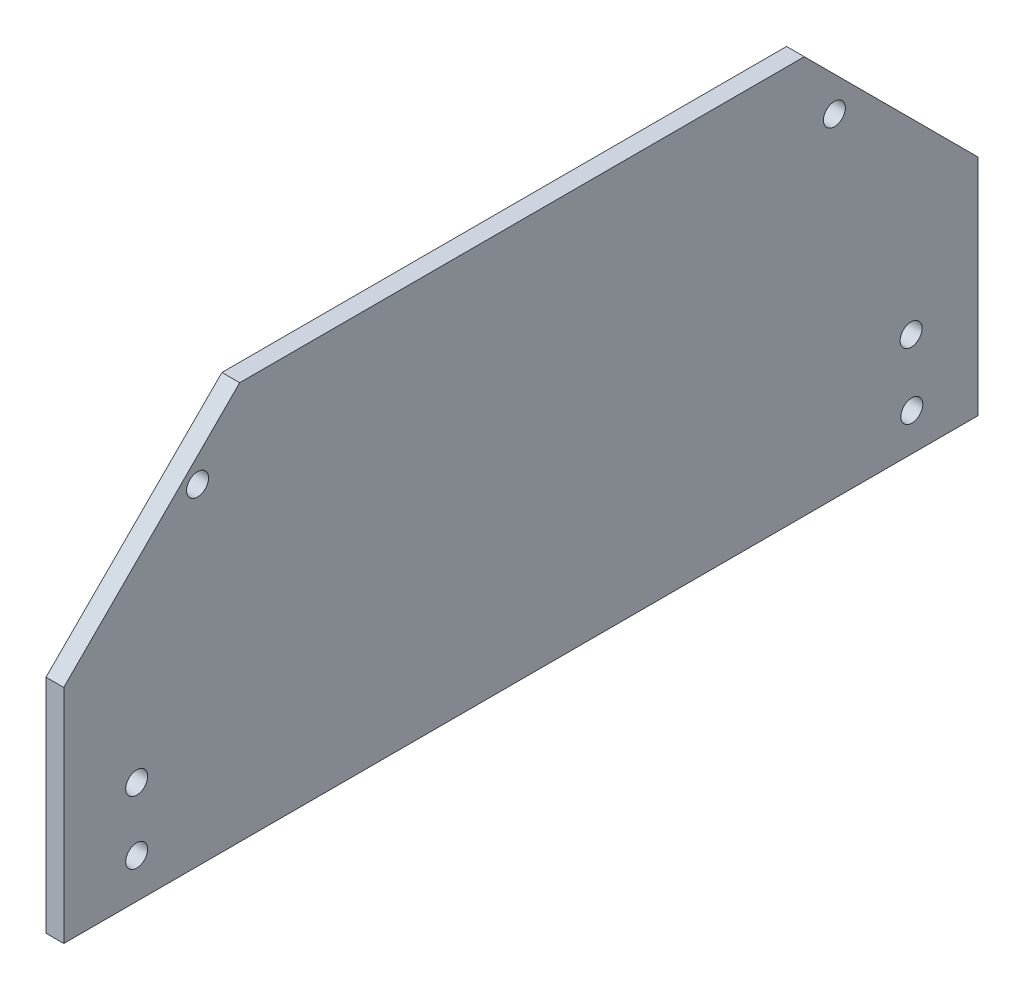
ISO-10303-21;
HEADER;
FILE_DESCRIPTION(('STEP AP214'),'2;1');
FILE_NAME('part.step','',(''),(''),'','','');
FILE_SCHEMA(('AUTOMOTIVE_DESIGN { 1 0 10303 214 1 1 1 1 }'));
ENDSEC;
DATA;
#1=APPLICATION_CONTEXT('core data for automotive mechanical design processes');
#2=APPLICATION_PROTOCOL_DEFINITION('international standard','automotive_design',2000,#1);
#3=PRODUCT_CONTEXT('',#1,'mechanical');
#4=PRODUCT('Part','Part','',(#3));
#5=PRODUCT_RELATED_PRODUCT_CATEGORY('part','',(#4));
#6=PRODUCT_DEFINITION_FORMATION('','',#4);
#7=PRODUCT_DEFINITION_CONTEXT('part definition',#1,'design');
#8=PRODUCT_DEFINITION('design','',#6,#7);
#9=PRODUCT_DEFINITION_SHAPE('','',#8);
#10=(LENGTH_UNIT() NAMED_UNIT(*) SI_UNIT(.MILLI.,.METRE.));
#11=(NAMED_UNIT(*) PLANE_ANGLE_UNIT() SI_UNIT($,.RADIAN.));
#12=(NAMED_UNIT(*) SI_UNIT($,.STERADIAN.) SOLID_ANGLE_UNIT());
#13=UNCERTAINTY_MEASURE_WITH_UNIT(LENGTH_MEASURE(1.E-05),#10,'distance_accuracy_value','');
#14=(GEOMETRIC_REPRESENTATION_CONTEXT(3) GLOBAL_UNCERTAINTY_ASSIGNED_CONTEXT((#13)) GLOBAL_UNIT_ASSIGNED_CONTEXT((#10,
#11,#12)) REPRESENTATION_CONTEXT('',''));
#15=CARTESIAN_POINT('',(0.,0.,0.));
#16=DIRECTION('',(0.,0.,1.));
#17=DIRECTION('',(1.,0.,0.));
#18=AXIS2_PLACEMENT_3D('',#15,#16,#17);
#19=CARTESIAN_POINT('',(3.,0.,0.));
#20=DIRECTION('',(1.,0.,0.));
#21=DIRECTION('',(0.,0.,-1.));
#22=AXIS2_PLACEMENT_3D('',#19,#20,#21);
#23=PLANE('',#22);
#24=CARTESIAN_POINT('',(3.,6.35000000000008,-143.256));
#25=DIRECTION('',(1.,0.,0.));
#26=DIRECTION('',(0.,0.,-1.));
#27=AXIS2_PLACEMENT_3D('',#24,#25,#26);
#28=CIRCLE('',#27,1.85399933999998);
#29=CARTESIAN_POINT('',(3.,6.35000000000008,-145.10999934));
#30=VERTEX_POINT('',#29);
#31=EDGE_CURVE('E197',#30,#30,#28,.T.);
#32=ORIENTED_EDGE('',*,*,#31,.F.);
#33=EDGE_LOOP('',(#32));
#34=FACE_BOUND('',#33,.T.);
#35=CARTESIAN_POINT('',(3.,55.88,-22.606));
#36=DIRECTION('',(1.,0.,0.));
#37=DIRECTION('',(0.,0.,-1.));
#38=AXIS2_PLACEMENT_3D('',#35,#36,#37);
#39=CIRCLE('',#38,1.85399933999996);
#40=CARTESIAN_POINT('',(3.,55.88,-24.4599993399999));
#41=VERTEX_POINT('',#40);
#42=EDGE_CURVE('E209',#41,#41,#39,.T.);
#43=ORIENTED_EDGE('',*,*,#42,.F.);
#44=EDGE_LOOP('',(#43));
#45=FACE_BOUND('',#44,.T.);
#46=CARTESIAN_POINT('',(3.,17.3990000000002,-12.319));
#47=DIRECTION('',(1.,0.,0.));
#48=DIRECTION('',(0.,0.,-1.));
#49=AXIS2_PLACEMENT_3D('',#46,#47,#48);
#50=CIRCLE('',#49,1.85399933999996);
#51=CARTESIAN_POINT('',(3.,17.3990000000002,-14.17299934));
#52=VERTEX_POINT('',#51);
#53=EDGE_CURVE('E121',#52,#52,#50,.T.);
#54=ORIENTED_EDGE('',*,*,#53,.F.);
#55=EDGE_LOOP('',(#54));
#56=FACE_BOUND('',#55,.T.);
#57=DIRECTION('',(0.,-0.707106781186547,0.707106781186549));
#58=VECTOR('',#57,1.);
#59=CARTESIAN_POINT('',(3.,37.4650000000001,0.));
#60=LINE('',#59,#58);
#61=CARTESIAN_POINT('',(3.,67.183,-29.718));
#62=VERTEX_POINT('',#61);
#63=CARTESIAN_POINT('',(3.,37.4650000000001,0.));
#64=VERTEX_POINT('',#63);
#65=EDGE_CURVE('E128',#62,#64,#60,.T.);
#66=ORIENTED_EDGE('',*,*,#65,.T.);
#67=DIRECTION('',(0.,-1.,0.));
#68=VECTOR('',#67,1.);
#69=CARTESIAN_POINT('',(3.,0.,0.));
#70=LINE('',#69,#68);
#71=CARTESIAN_POINT('',(3.,0.,0.));
#72=VERTEX_POINT('',#71);
#73=EDGE_CURVE('E86',#64,#72,#70,.T.);
#74=ORIENTED_EDGE('',*,*,#73,.T.);
#75=DIRECTION('',(0.,0.,-1.));
#76=VECTOR('',#75,1.);
#77=CARTESIAN_POINT('',(3.,1.11022302462516E-13,-154.432));
#78=LINE('',#77,#76);
#79=CARTESIAN_POINT('',(3.,1.11022302462516E-13,-154.432));
#80=VERTEX_POINT('',#79);
#81=EDGE_CURVE('E99',#72,#80,#78,.T.);
#82=ORIENTED_EDGE('',*,*,#81,.T.);
#83=DIRECTION('',(0.,1.,0.));
#84=VECTOR('',#83,1.);
#85=CARTESIAN_POINT('',(3.,37.846,-154.432));
#86=LINE('',#85,#84);
#87=CARTESIAN_POINT('',(3.,37.846,-154.432));
#88=VERTEX_POINT('',#87);
#89=EDGE_CURVE('E93',#80,#88,#86,.T.);
#90=ORIENTED_EDGE('',*,*,#89,.T.);
#91=DIRECTION('',(0.,0.707106781186547,0.707106781186548));
#92=VECTOR('',#91,1.);
#93=CARTESIAN_POINT('',(3.,37.846,-154.432));
#94=LINE('',#93,#92);
#95=CARTESIAN_POINT('',(3.,67.183,-125.095));
#96=VERTEX_POINT('',#95);
#97=EDGE_CURVE('E97',#88,#96,#94,.T.);
#98=ORIENTED_EDGE('',*,*,#97,.T.);
#99=DIRECTION('',(0.,0.,1.));
#100=VECTOR('',#99,1.);
#101=CARTESIAN_POINT('',(3.,67.183,-29.718));
#102=LINE('',#101,#100);
#103=EDGE_CURVE('E49',#96,#62,#102,.T.);
#104=ORIENTED_EDGE('',*,*,#103,.T.);
#105=EDGE_LOOP('',(#66,#74,#82,#90,#98,#104));
#106=FACE_BOUND('',#105,.T.);
#107=CARTESIAN_POINT('',(3.,6.73100000000015,-12.319));
#108=DIRECTION('',(1.,0.,0.));
#109=DIRECTION('',(0.,0.,-1.));
#110=AXIS2_PLACEMENT_3D('',#107,#108,#109);
#111=CIRCLE('',#110,1.85399934000003);
#112=CARTESIAN_POINT('',(3.,6.73100000000015,-14.17299934));
#113=VERTEX_POINT('',#112);
#114=EDGE_CURVE('E215',#113,#113,#111,.T.);
#115=ORIENTED_EDGE('',*,*,#114,.F.);
#116=EDGE_LOOP('',(#115));
#117=FACE_BOUND('',#116,.T.);
#118=CARTESIAN_POINT('',(3.,56.261,-130.175));
#119=DIRECTION('',(1.,0.,0.));
#120=DIRECTION('',(0.,0.,-1.));
#121=AXIS2_PLACEMENT_3D('',#118,#119,#120);
#122=CIRCLE('',#121,1.85399934000004);
#123=CARTESIAN_POINT('',(3.,56.261,-132.02899934));
#124=VERTEX_POINT('',#123);
#125=EDGE_CURVE('E203',#124,#124,#122,.T.);
#126=ORIENTED_EDGE('',*,*,#125,.F.);
#127=EDGE_LOOP('',(#126));
#128=FACE_BOUND('',#127,.T.);
#129=CARTESIAN_POINT('',(3.,17.5260000000001,-143.129));
#130=DIRECTION('',(1.,0.,0.));
#131=DIRECTION('',(0.,0.,-1.));
#132=AXIS2_PLACEMENT_3D('',#129,#130,#131);
#133=CIRCLE('',#132,1.85399933999998);
#134=CARTESIAN_POINT('',(3.,17.5260000000001,-144.98299934));
#135=VERTEX_POINT('',#134);
#136=EDGE_CURVE('E188',#135,#135,#133,.T.);
#137=ORIENTED_EDGE('',*,*,#136,.F.);
#138=EDGE_LOOP('',(#137));
#139=FACE_BOUND('',#138,.T.);
#140=ADVANCED_FACE('F32',(#34,#45,#56,#106,#117,#128,#139),#23,.T.);
#141=CARTESIAN_POINT('',(0.,0.,0.));
#142=DIRECTION('',(1.,0.,0.));
#143=DIRECTION('',(0.,0.,-1.));
#144=AXIS2_PLACEMENT_3D('',#141,#142,#143);
#145=PLANE('',#144);
#146=CARTESIAN_POINT('',(0.,6.35000000000008,-143.256));
#147=DIRECTION('',(1.,0.,0.));
#148=DIRECTION('',(0.,0.,-1.));
#149=AXIS2_PLACEMENT_3D('',#146,#147,#148);
#150=CIRCLE('',#149,1.85399933999998);
#151=CARTESIAN_POINT('',(0.,6.35000000000008,-145.10999934));
#152=VERTEX_POINT('',#151);
#153=EDGE_CURVE('E194',#152,#152,#150,.T.);
#154=ORIENTED_EDGE('',*,*,#153,.T.);
#155=EDGE_LOOP('',(#154));
#156=FACE_BOUND('',#155,.T.);
#157=CARTESIAN_POINT('',(0.,55.88,-22.606));
#158=DIRECTION('',(1.,0.,0.));
#159=DIRECTION('',(0.,0.,-1.));
#160=AXIS2_PLACEMENT_3D('',#157,#158,#159);
#161=CIRCLE('',#160,1.85399933999996);
#162=CARTESIAN_POINT('',(0.,55.88,-24.4599993399999));
#163=VERTEX_POINT('',#162);
#164=EDGE_CURVE('E206',#163,#163,#161,.T.);
#165=ORIENTED_EDGE('',*,*,#164,.T.);
#166=EDGE_LOOP('',(#165));
#167=FACE_BOUND('',#166,.T.);
#168=CARTESIAN_POINT('',(0.,17.3990000000002,-12.319));
#169=DIRECTION('',(1.,0.,0.));
#170=DIRECTION('',(0.,0.,-1.));
#171=AXIS2_PLACEMENT_3D('',#168,#169,#170);
#172=CIRCLE('',#171,1.85399933999996);
#173=CARTESIAN_POINT('',(0.,17.3990000000002,-14.17299934));
#174=VERTEX_POINT('',#173);
#175=EDGE_CURVE('E218',#174,#174,#172,.T.);
#176=ORIENTED_EDGE('',*,*,#175,.T.);
#177=EDGE_LOOP('',(#176));
#178=FACE_BOUND('',#177,.T.);
#179=DIRECTION('',(0.,-0.707106781186547,0.707106781186549));
#180=VECTOR('',#179,1.);
#181=CARTESIAN_POINT('',(0.,37.4650000000001,0.));
#182=LINE('',#181,#180);
#183=CARTESIAN_POINT('',(0.,67.183,-29.718));
#184=VERTEX_POINT('',#183);
#185=CARTESIAN_POINT('',(0.,37.4650000000001,0.));
#186=VERTEX_POINT('',#185);
#187=EDGE_CURVE('E117',#184,#186,#182,.T.);
#188=ORIENTED_EDGE('',*,*,#187,.F.);
#189=DIRECTION('',(0.,0.,1.));
#190=VECTOR('',#189,1.);
#191=CARTESIAN_POINT('',(0.,67.183,-29.718));
#192=LINE('',#191,#190);
#193=CARTESIAN_POINT('',(0.,67.183,-125.095));
#194=VERTEX_POINT('',#193);
#195=EDGE_CURVE('E78',#194,#184,#192,.T.);
#196=ORIENTED_EDGE('',*,*,#195,.F.);
#197=DIRECTION('',(0.,0.707106781186547,0.707106781186548));
#198=VECTOR('',#197,1.);
#199=CARTESIAN_POINT('',(0.,37.846,-154.432));
#200=LINE('',#199,#198);
#201=CARTESIAN_POINT('',(0.,37.846,-154.432));
#202=VERTEX_POINT('',#201);
#203=EDGE_CURVE('E72',#202,#194,#200,.T.);
#204=ORIENTED_EDGE('',*,*,#203,.F.);
#205=DIRECTION('',(0.,1.,0.));
#206=VECTOR('',#205,1.);
#207=CARTESIAN_POINT('',(0.,37.846,-154.432));
#208=LINE('',#207,#206);
#209=CARTESIAN_POINT('',(0.,1.11022302462516E-13,-154.432));
#210=VERTEX_POINT('',#209);
#211=EDGE_CURVE('E107',#210,#202,#208,.T.);
#212=ORIENTED_EDGE('',*,*,#211,.F.);
#213=DIRECTION('',(0.,0.,-1.));
#214=VECTOR('',#213,1.);
#215=CARTESIAN_POINT('',(0.,1.11022302462516E-13,-154.432));
#216=LINE('',#215,#214);
#217=CARTESIAN_POINT('',(0.,0.,0.));
#218=VERTEX_POINT('',#217);
#219=EDGE_CURVE('E123',#218,#210,#216,.T.);
#220=ORIENTED_EDGE('',*,*,#219,.F.);
#221=DIRECTION('',(0.,-1.,0.));
#222=VECTOR('',#221,1.);
#223=CARTESIAN_POINT('',(0.,0.,0.));
#224=LINE('',#223,#222);
#225=EDGE_CURVE('E120',#186,#218,#224,.T.);
#226=ORIENTED_EDGE('',*,*,#225,.F.);
#227=EDGE_LOOP('',(#188,#196,#204,#212,#220,#226));
#228=FACE_BOUND('',#227,.T.);
#229=CARTESIAN_POINT('',(0.,6.73100000000015,-12.319));
#230=DIRECTION('',(1.,0.,0.));
#231=DIRECTION('',(0.,0.,-1.));
#232=AXIS2_PLACEMENT_3D('',#229,#230,#231);
#233=CIRCLE('',#232,1.85399934000003);
#234=CARTESIAN_POINT('',(0.,6.73100000000015,-14.17299934));
#235=VERTEX_POINT('',#234);
#236=EDGE_CURVE('E212',#235,#235,#233,.T.);
#237=ORIENTED_EDGE('',*,*,#236,.T.);
#238=EDGE_LOOP('',(#237));
#239=FACE_BOUND('',#238,.T.);
#240=CARTESIAN_POINT('',(0.,56.261,-130.175));
#241=DIRECTION('',(1.,0.,0.));
#242=DIRECTION('',(0.,0.,-1.));
#243=AXIS2_PLACEMENT_3D('',#240,#241,#242);
#244=CIRCLE('',#243,1.85399934000004);
#245=CARTESIAN_POINT('',(0.,56.261,-132.02899934));
#246=VERTEX_POINT('',#245);
#247=EDGE_CURVE('E200',#246,#246,#244,.T.);
#248=ORIENTED_EDGE('',*,*,#247,.T.);
#249=EDGE_LOOP('',(#248));
#250=FACE_BOUND('',#249,.T.);
#251=CARTESIAN_POINT('',(0.,17.5260000000001,-143.129));
#252=DIRECTION('',(1.,0.,0.));
#253=DIRECTION('',(0.,0.,-1.));
#254=AXIS2_PLACEMENT_3D('',#251,#252,#253);
#255=CIRCLE('',#254,1.85399933999998);
#256=CARTESIAN_POINT('',(0.,17.5260000000001,-144.98299934));
#257=VERTEX_POINT('',#256);
#258=EDGE_CURVE('E191',#257,#257,#255,.T.);
#259=ORIENTED_EDGE('',*,*,#258,.T.);
#260=EDGE_LOOP('',(#259));
#261=FACE_BOUND('',#260,.T.);
#262=ADVANCED_FACE('F137',(#156,#167,#178,#228,#239,#250,#261),#145,.F.);
#263=CARTESIAN_POINT('',(3.,37.4650000000001,0.));
#264=DIRECTION('',(0.,-0.707106781186548,-0.707106781186546));
#265=DIRECTION('',(0.,0.707106781186547,-0.707106781186549));
#266=AXIS2_PLACEMENT_3D('',#263,#264,#265);
#267=PLANE('',#266);
#268=ORIENTED_EDGE('',*,*,#187,.T.);
#269=DIRECTION('',(-1.,0.,0.));
#270=VECTOR('',#269,1.);
#271=CARTESIAN_POINT('',(3.,37.4650000000001,0.));
#272=LINE('',#271,#270);
#273=EDGE_CURVE('E11',#64,#186,#272,.T.);
#274=ORIENTED_EDGE('',*,*,#273,.F.);
#275=ORIENTED_EDGE('',*,*,#65,.F.);
#276=DIRECTION('',(-1.,0.,0.));
#277=VECTOR('',#276,1.);
#278=CARTESIAN_POINT('',(3.,67.183,-29.718));
#279=LINE('',#278,#277);
#280=EDGE_CURVE('E113',#62,#184,#279,.T.);
#281=ORIENTED_EDGE('',*,*,#280,.T.);
#282=EDGE_LOOP('',(#268,#274,#275,#281));
#283=FACE_BOUND('',#282,.T.);
#284=ADVANCED_FACE('F34',(#283),#267,.F.);
#285=CARTESIAN_POINT('',(3.,0.,0.));
#286=DIRECTION('',(0.,0.,-1.));
#287=DIRECTION('',(-1.,0.,0.));
#288=AXIS2_PLACEMENT_3D('',#285,#286,#287);
#289=PLANE('',#288);
#290=ORIENTED_EDGE('',*,*,#225,.T.);
#291=DIRECTION('',(-1.,0.,0.));
#292=VECTOR('',#291,1.);
#293=CARTESIAN_POINT('',(3.,0.,0.));
#294=LINE('',#293,#292);
#295=EDGE_CURVE('E41',#72,#218,#294,.T.);
#296=ORIENTED_EDGE('',*,*,#295,.F.);
#297=ORIENTED_EDGE('',*,*,#73,.F.);
#298=ORIENTED_EDGE('',*,*,#273,.T.);
#299=EDGE_LOOP('',(#290,#296,#297,#298));
#300=FACE_BOUND('',#299,.T.);
#301=ADVANCED_FACE('F293',(#300),#289,.F.);
#302=CARTESIAN_POINT('',(3.,1.11022302462516E-13,-154.432));
#303=DIRECTION('',(0.,1.,0.));
#304=DIRECTION('',(0.,0.,1.));
#305=AXIS2_PLACEMENT_3D('',#302,#303,#304);
#306=PLANE('',#305);
#307=ORIENTED_EDGE('',*,*,#219,.T.);
#308=DIRECTION('',(-1.,0.,0.));
#309=VECTOR('',#308,1.);
#310=CARTESIAN_POINT('',(3.,1.11022302462516E-13,-154.432));
#311=LINE('',#310,#309);
#312=EDGE_CURVE('E108',#80,#210,#311,.T.);
#313=ORIENTED_EDGE('',*,*,#312,.F.);
#314=ORIENTED_EDGE('',*,*,#81,.F.);
#315=ORIENTED_EDGE('',*,*,#295,.T.);
#316=EDGE_LOOP('',(#307,#313,#314,#315));
#317=FACE_BOUND('',#316,.T.);
#318=ADVANCED_FACE('F134',(#317),#306,.F.);
#319=CARTESIAN_POINT('',(3.,37.846,-154.432));
#320=DIRECTION('',(0.,0.,1.));
#321=DIRECTION('',(1.,0.,0.));
#322=AXIS2_PLACEMENT_3D('',#319,#320,#321);
#323=PLANE('',#322);
#324=ORIENTED_EDGE('',*,*,#211,.T.);
#325=DIRECTION('',(-1.,0.,0.));
#326=VECTOR('',#325,1.);
#327=CARTESIAN_POINT('',(3.,37.846,-154.432));
#328=LINE('',#327,#326);
#329=EDGE_CURVE('E104',#88,#202,#328,.T.);
#330=ORIENTED_EDGE('',*,*,#329,.F.);
#331=ORIENTED_EDGE('',*,*,#89,.F.);
#332=ORIENTED_EDGE('',*,*,#312,.T.);
#333=EDGE_LOOP('',(#324,#330,#331,#332));
#334=FACE_BOUND('',#333,.T.);
#335=ADVANCED_FACE('F105',(#334),#323,.F.);
#336=CARTESIAN_POINT('',(3.,37.846,-154.432));
#337=DIRECTION('',(0.,-0.707106781186548,0.707106781186547));
#338=DIRECTION('',(0.,-0.707106781186547,-0.707106781186548));
#339=AXIS2_PLACEMENT_3D('',#336,#337,#338);
#340=PLANE('',#339);
#341=ORIENTED_EDGE('',*,*,#203,.T.);
#342=DIRECTION('',(-1.,0.,0.));
#343=VECTOR('',#342,1.);
#344=CARTESIAN_POINT('',(3.,67.183,-125.095));
#345=LINE('',#344,#343);
#346=EDGE_CURVE('E109',#96,#194,#345,.T.);
#347=ORIENTED_EDGE('',*,*,#346,.F.);
#348=ORIENTED_EDGE('',*,*,#97,.F.);
#349=ORIENTED_EDGE('',*,*,#329,.T.);
#350=EDGE_LOOP('',(#341,#347,#348,#349));
#351=FACE_BOUND('',#350,.T.);
#352=ADVANCED_FACE('F111',(#351),#340,.F.);
#353=CARTESIAN_POINT('',(3.,67.183,-29.718));
#354=DIRECTION('',(0.,-1.,0.));
#355=DIRECTION('',(0.,0.,-1.));
#356=AXIS2_PLACEMENT_3D('',#353,#354,#355);
#357=PLANE('',#356);
#358=ORIENTED_EDGE('',*,*,#195,.T.);
#359=ORIENTED_EDGE('',*,*,#280,.F.);
#360=ORIENTED_EDGE('',*,*,#103,.F.);
#361=ORIENTED_EDGE('',*,*,#346,.T.);
#362=EDGE_LOOP('',(#358,#359,#360,#361));
#363=FACE_BOUND('',#362,.T.);
#364=ADVANCED_FACE('F142',(#363),#357,.F.);
#365=CARTESIAN_POINT('',(3.,17.3990000000002,-12.319));
#366=DIRECTION('',(-1.,0.,0.));
#367=DIRECTION('',(0.,0.,1.));
#368=AXIS2_PLACEMENT_3D('',#365,#366,#367);
#369=CYLINDRICAL_SURFACE('',#368,1.85399933999996);
#370=ORIENTED_EDGE('',*,*,#53,.T.);
#371=EDGE_LOOP('',(#370));
#372=FACE_BOUND('',#371,.T.);
#373=ORIENTED_EDGE('',*,*,#175,.F.);
#374=EDGE_LOOP('',(#373));
#375=FACE_BOUND('',#374,.T.);
#376=ADVANCED_FACE('F144',(#372,#375),#369,.F.);
#377=CARTESIAN_POINT('',(3.,6.73100000000015,-12.319));
#378=DIRECTION('',(-1.,0.,0.));
#379=DIRECTION('',(0.,0.,1.));
#380=AXIS2_PLACEMENT_3D('',#377,#378,#379);
#381=CYLINDRICAL_SURFACE('',#380,1.85399934000003);
#382=ORIENTED_EDGE('',*,*,#114,.T.);
#383=EDGE_LOOP('',(#382));
#384=FACE_BOUND('',#383,.T.);
#385=ORIENTED_EDGE('',*,*,#236,.F.);
#386=EDGE_LOOP('',(#385));
#387=FACE_BOUND('',#386,.T.);
#388=ADVANCED_FACE('F150',(#384,#387),#381,.F.);
#389=CARTESIAN_POINT('',(3.,55.88,-22.606));
#390=DIRECTION('',(-1.,0.,0.));
#391=DIRECTION('',(0.,0.,1.));
#392=AXIS2_PLACEMENT_3D('',#389,#390,#391);
#393=CYLINDRICAL_SURFACE('',#392,1.85399933999996);
#394=ORIENTED_EDGE('',*,*,#42,.T.);
#395=EDGE_LOOP('',(#394));
#396=FACE_BOUND('',#395,.T.);
#397=ORIENTED_EDGE('',*,*,#164,.F.);
#398=EDGE_LOOP('',(#397));
#399=FACE_BOUND('',#398,.T.);
#400=ADVANCED_FACE('F167',(#396,#399),#393,.F.);
#401=CARTESIAN_POINT('',(3.,56.261,-130.175));
#402=DIRECTION('',(-1.,0.,0.));
#403=DIRECTION('',(0.,0.,1.));
#404=AXIS2_PLACEMENT_3D('',#401,#402,#403);
#405=CYLINDRICAL_SURFACE('',#404,1.85399934000004);
#406=ORIENTED_EDGE('',*,*,#125,.T.);
#407=EDGE_LOOP('',(#406));
#408=FACE_BOUND('',#407,.T.);
#409=ORIENTED_EDGE('',*,*,#247,.F.);
#410=EDGE_LOOP('',(#409));
#411=FACE_BOUND('',#410,.T.);
#412=ADVANCED_FACE('F171',(#408,#411),#405,.F.);
#413=CARTESIAN_POINT('',(3.,6.35000000000008,-143.256));
#414=DIRECTION('',(-1.,0.,0.));
#415=DIRECTION('',(0.,0.,1.));
#416=AXIS2_PLACEMENT_3D('',#413,#414,#415);
#417=CYLINDRICAL_SURFACE('',#416,1.85399933999998);
#418=ORIENTED_EDGE('',*,*,#31,.T.);
#419=EDGE_LOOP('',(#418));
#420=FACE_BOUND('',#419,.T.);
#421=ORIENTED_EDGE('',*,*,#153,.F.);
#422=EDGE_LOOP('',(#421));
#423=FACE_BOUND('',#422,.T.);
#424=ADVANCED_FACE('F175',(#420,#423),#417,.F.);
#425=CARTESIAN_POINT('',(3.,17.5260000000001,-143.129));
#426=DIRECTION('',(-1.,0.,0.));
#427=DIRECTION('',(0.,0.,1.));
#428=AXIS2_PLACEMENT_3D('',#425,#426,#427);
#429=CYLINDRICAL_SURFACE('',#428,1.85399933999998);
#430=ORIENTED_EDGE('',*,*,#136,.T.);
#431=EDGE_LOOP('',(#430));
#432=FACE_BOUND('',#431,.T.);
#433=ORIENTED_EDGE('',*,*,#258,.F.);
#434=EDGE_LOOP('',(#433));
#435=FACE_BOUND('',#434,.T.);
#436=ADVANCED_FACE('F179',(#432,#435),#429,.F.);
#437=CLOSED_SHELL('',(#140,#262,#284,#301,#318,#335,#352,#364,#376,#388,#400,#412,#424,#436));
#438=MANIFOLD_SOLID_BREP('B2',#437);
#439=ADVANCED_BREP_SHAPE_REPRESENTATION('',(#18,#438),#14);
#440=SHAPE_DEFINITION_REPRESENTATION(#9,#439);
ENDSEC;
END-ISO-10303-21;
